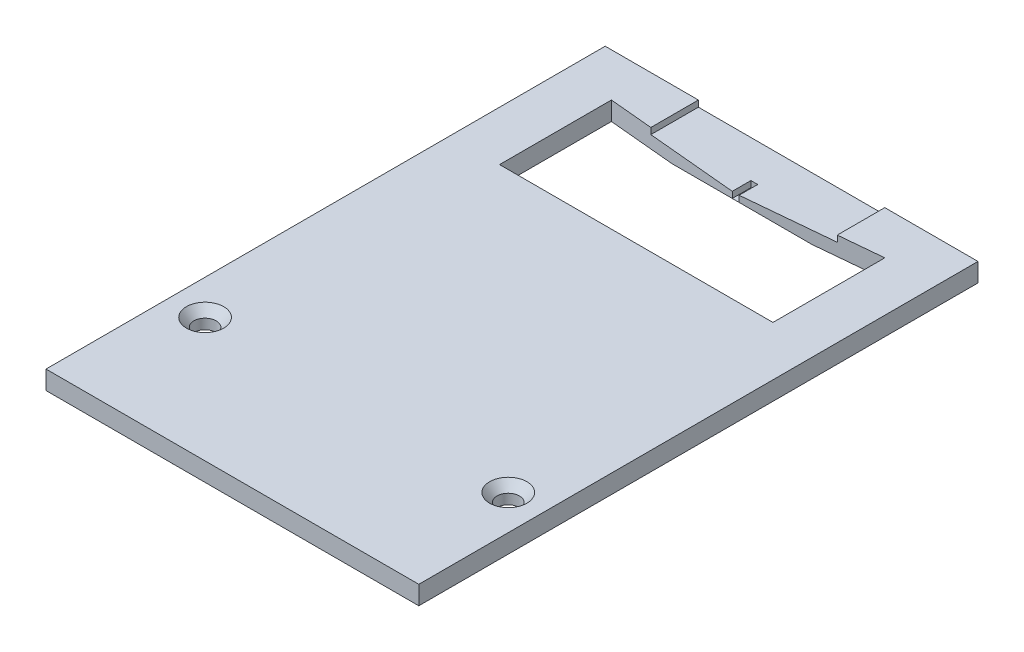
ISO-10303-21;
HEADER;
FILE_DESCRIPTION(('STEP AP214'),'2;1');
FILE_NAME('part.step','',(''),(''),'','','');
FILE_SCHEMA(('AUTOMOTIVE_DESIGN { 1 0 10303 214 1 1 1 1 }'));
ENDSEC;
DATA;
#1=APPLICATION_CONTEXT('core data for automotive mechanical design processes');
#2=APPLICATION_PROTOCOL_DEFINITION('international standard','automotive_design',2000,#1);
#3=PRODUCT_CONTEXT('',#1,'mechanical');
#4=PRODUCT('Part','Part','',(#3));
#5=PRODUCT_RELATED_PRODUCT_CATEGORY('part','',(#4));
#6=PRODUCT_DEFINITION_FORMATION('','',#4);
#7=PRODUCT_DEFINITION_CONTEXT('part definition',#1,'design');
#8=PRODUCT_DEFINITION('design','',#6,#7);
#9=PRODUCT_DEFINITION_SHAPE('','',#8);
#10=(LENGTH_UNIT() NAMED_UNIT(*) SI_UNIT(.MILLI.,.METRE.));
#11=(NAMED_UNIT(*) PLANE_ANGLE_UNIT() SI_UNIT($,.RADIAN.));
#12=(NAMED_UNIT(*) SI_UNIT($,.STERADIAN.) SOLID_ANGLE_UNIT());
#13=UNCERTAINTY_MEASURE_WITH_UNIT(LENGTH_MEASURE(1.E-05),#10,'distance_accuracy_value','');
#14=(GEOMETRIC_REPRESENTATION_CONTEXT(3) GLOBAL_UNCERTAINTY_ASSIGNED_CONTEXT((#13)) GLOBAL_UNIT_ASSIGNED_CONTEXT((#10,
#11,#12)) REPRESENTATION_CONTEXT('',''));
#15=CARTESIAN_POINT('',(0.,0.,0.));
#16=DIRECTION('',(0.,0.,1.));
#17=DIRECTION('',(1.,0.,0.));
#18=AXIS2_PLACEMENT_3D('',#15,#16,#17);
#19=CARTESIAN_POINT('',(0.,3.,0.));
#20=DIRECTION('',(0.,-1.,0.));
#21=DIRECTION('',(0.,0.,-1.));
#22=AXIS2_PLACEMENT_3D('',#19,#20,#21);
#23=PLANE('',#22);
#24=CARTESIAN_POINT('',(-24.4,3.,0.));
#25=DIRECTION('',(0.,1.,0.));
#26=DIRECTION('',(0.,0.,1.));
#27=AXIS2_PLACEMENT_3D('',#24,#25,#26);
#28=CIRCLE('',#27,3.);
#29=CARTESIAN_POINT('',(-24.4,3.,3.));
#30=VERTEX_POINT('',#29);
#31=EDGE_CURVE('E197',#30,#30,#28,.T.);
#32=ORIENTED_EDGE('',*,*,#31,.F.);
#33=EDGE_LOOP('',(#32));
#34=FACE_BOUND('',#33,.T.);
#35=CARTESIAN_POINT('',(24.4,3.,0.));
#36=DIRECTION('',(0.,1.,0.));
#37=DIRECTION('',(0.,0.,1.));
#38=AXIS2_PLACEMENT_3D('',#35,#36,#37);
#39=CIRCLE('',#38,3.);
#40=CARTESIAN_POINT('',(24.4,3.,3.));
#41=VERTEX_POINT('',#40);
#42=EDGE_CURVE('E200',#41,#41,#39,.T.);
#43=ORIENTED_EDGE('',*,*,#42,.F.);
#44=EDGE_LOOP('',(#43));
#45=FACE_BOUND('',#44,.T.);
#46=DIRECTION('',(-0.995681281474736,0.,0.09283741552212));
#47=VECTOR('',#46,1.);
#48=CARTESIAN_POINT('',(0.549999999999998,3.,-61.));
#49=LINE('',#48,#47);
#50=CARTESIAN_POINT('',(22.,3.,-63.));
#51=VERTEX_POINT('',#50);
#52=CARTESIAN_POINT('',(15.,3.,-62.3473193473193));
#53=VERTEX_POINT('',#52);
#54=EDGE_CURVE('E159',#51,#53,#49,.T.);
#55=ORIENTED_EDGE('',*,*,#54,.F.);
#56=DIRECTION('',(0.,0.,-1.));
#57=VECTOR('',#56,1.);
#58=CARTESIAN_POINT('',(22.,3.,-61.));
#59=LINE('',#58,#57);
#60=CARTESIAN_POINT('',(22.,3.,-45.));
#61=VERTEX_POINT('',#60);
#62=EDGE_CURVE('E254',#61,#51,#59,.T.);
#63=ORIENTED_EDGE('',*,*,#62,.F.);
#64=DIRECTION('',(1.,0.,0.));
#65=VECTOR('',#64,1.);
#66=CARTESIAN_POINT('',(-22.,3.,-45.));
#67=LINE('',#66,#65);
#68=CARTESIAN_POINT('',(-22.,3.,-45.));
#69=VERTEX_POINT('',#68);
#70=EDGE_CURVE('E251',#69,#61,#67,.T.);
#71=ORIENTED_EDGE('',*,*,#70,.F.);
#72=DIRECTION('',(0.,0.,1.));
#73=VECTOR('',#72,1.);
#74=CARTESIAN_POINT('',(-22.,3.,-61.));
#75=LINE('',#74,#73);
#76=CARTESIAN_POINT('',(-22.,3.,-63.));
#77=VERTEX_POINT('',#76);
#78=EDGE_CURVE('E249',#77,#69,#75,.T.);
#79=ORIENTED_EDGE('',*,*,#78,.F.);
#80=DIRECTION('',(-0.995681281474736,0.,-0.09283741552212));
#81=VECTOR('',#80,1.);
#82=CARTESIAN_POINT('',(-0.549999999999998,3.,-61.));
#83=LINE('',#82,#81);
#84=CARTESIAN_POINT('',(-15.,3.,-62.3473193473193));
#85=VERTEX_POINT('',#84);
#86=EDGE_CURVE('E175',#85,#77,#83,.T.);
#87=ORIENTED_EDGE('',*,*,#86,.F.);
#88=DIRECTION('',(0.,0.,1.));
#89=VECTOR('',#88,1.);
#90=CARTESIAN_POINT('',(-15.,3.,-61.));
#91=LINE('',#90,#89);
#92=CARTESIAN_POINT('',(-15.,3.,-70.));
#93=VERTEX_POINT('',#92);
#94=EDGE_CURVE('E225',#93,#85,#91,.T.);
#95=ORIENTED_EDGE('',*,*,#94,.F.);
#96=DIRECTION('',(-1.,0.,0.));
#97=VECTOR('',#96,1.);
#98=CARTESIAN_POINT('',(30.,3.,-70.));
#99=LINE('',#98,#97);
#100=CARTESIAN_POINT('',(-30.,3.,-70.));
#101=VERTEX_POINT('',#100);
#102=EDGE_CURVE('E274',#93,#101,#99,.T.);
#103=ORIENTED_EDGE('',*,*,#102,.T.);
#104=DIRECTION('',(0.,0.,1.));
#105=VECTOR('',#104,1.);
#106=CARTESIAN_POINT('',(-30.,3.,-20.));
#107=LINE('',#106,#105);
#108=CARTESIAN_POINT('',(-30.,3.,20.));
#109=VERTEX_POINT('',#108);
#110=EDGE_CURVE('E267',#101,#109,#107,.T.);
#111=ORIENTED_EDGE('',*,*,#110,.T.);
#112=DIRECTION('',(1.,0.,0.));
#113=VECTOR('',#112,1.);
#114=CARTESIAN_POINT('',(-30.,3.,20.));
#115=LINE('',#114,#113);
#116=CARTESIAN_POINT('',(30.,3.,20.));
#117=VERTEX_POINT('',#116);
#118=EDGE_CURVE('E269',#109,#117,#115,.T.);
#119=ORIENTED_EDGE('',*,*,#118,.T.);
#120=DIRECTION('',(0.,0.,-1.));
#121=VECTOR('',#120,1.);
#122=CARTESIAN_POINT('',(30.,3.,-20.));
#123=LINE('',#122,#121);
#124=CARTESIAN_POINT('',(30.,3.,-70.));
#125=VERTEX_POINT('',#124);
#126=EDGE_CURVE('E272',#117,#125,#123,.T.);
#127=ORIENTED_EDGE('',*,*,#126,.T.);
#128=CARTESIAN_POINT('',(15.,3.,-70.));
#129=VERTEX_POINT('',#128);
#130=EDGE_CURVE('E275',#125,#129,#99,.T.);
#131=ORIENTED_EDGE('',*,*,#130,.T.);
#132=DIRECTION('',(0.,0.,-1.));
#133=VECTOR('',#132,1.);
#134=CARTESIAN_POINT('',(15.,3.,-61.));
#135=LINE('',#134,#133);
#136=EDGE_CURVE('E235',#53,#129,#135,.T.);
#137=ORIENTED_EDGE('',*,*,#136,.F.);
#138=EDGE_LOOP('',(#55,#63,#71,#79,#87,#95,#103,#111,#119,#127,#131,#137));
#139=FACE_BOUND('',#138,.T.);
#140=ADVANCED_FACE('F35',(#34,#45,#139),#23,.F.);
#141=CARTESIAN_POINT('',(0.,0.,0.));
#142=DIRECTION('',(0.,-1.,0.));
#143=DIRECTION('',(0.,0.,-1.));
#144=AXIS2_PLACEMENT_3D('',#141,#142,#143);
#145=PLANE('',#144);
#146=DIRECTION('',(1.,0.,0.));
#147=VECTOR('',#146,1.);
#148=CARTESIAN_POINT('',(22.,0.,-62.));
#149=LINE('',#148,#147);
#150=CARTESIAN_POINT('',(-11.2749999999997,0.,-62.));
#151=VERTEX_POINT('',#150);
#152=CARTESIAN_POINT('',(11.2750000000001,0.,-62.));
#153=VERTEX_POINT('',#152);
#154=EDGE_CURVE('E50',#151,#153,#149,.T.);
#155=ORIENTED_EDGE('',*,*,#154,.F.);
#156=DIRECTION('',(-0.995681281474736,0.,-0.09283741552212));
#157=VECTOR('',#156,1.);
#158=CARTESIAN_POINT('',(-0.549999999999998,0.,-61.));
#159=LINE('',#158,#157);
#160=CARTESIAN_POINT('',(-22.,0.,-63.));
#161=VERTEX_POINT('',#160);
#162=EDGE_CURVE('E165',#151,#161,#159,.T.);
#163=ORIENTED_EDGE('',*,*,#162,.T.);
#164=DIRECTION('',(0.,0.,1.));
#165=VECTOR('',#164,1.);
#166=CARTESIAN_POINT('',(-22.,0.,-61.));
#167=LINE('',#166,#165);
#168=CARTESIAN_POINT('',(-22.,0.,-45.));
#169=VERTEX_POINT('',#168);
#170=EDGE_CURVE('E246',#161,#169,#167,.T.);
#171=ORIENTED_EDGE('',*,*,#170,.T.);
#172=DIRECTION('',(1.,0.,0.));
#173=VECTOR('',#172,1.);
#174=CARTESIAN_POINT('',(-22.,0.,-45.));
#175=LINE('',#174,#173);
#176=CARTESIAN_POINT('',(22.,0.,-45.));
#177=VERTEX_POINT('',#176);
#178=EDGE_CURVE('E258',#169,#177,#175,.T.);
#179=ORIENTED_EDGE('',*,*,#178,.T.);
#180=DIRECTION('',(0.,0.,-1.));
#181=VECTOR('',#180,1.);
#182=CARTESIAN_POINT('',(22.,0.,-61.));
#183=LINE('',#182,#181);
#184=CARTESIAN_POINT('',(22.,0.,-63.));
#185=VERTEX_POINT('',#184);
#186=EDGE_CURVE('E252',#177,#185,#183,.T.);
#187=ORIENTED_EDGE('',*,*,#186,.T.);
#188=DIRECTION('',(-0.995681281474736,0.,0.09283741552212));
#189=VECTOR('',#188,1.);
#190=CARTESIAN_POINT('',(0.549999999999998,0.,-61.));
#191=LINE('',#190,#189);
#192=EDGE_CURVE('E168',#185,#153,#191,.T.);
#193=ORIENTED_EDGE('',*,*,#192,.T.);
#194=EDGE_LOOP('',(#155,#163,#171,#179,#187,#193));
#195=FACE_BOUND('',#194,.T.);
#196=CARTESIAN_POINT('',(24.4,0.,0.));
#197=DIRECTION('',(0.,1.,0.));
#198=DIRECTION('',(0.,0.,1.));
#199=AXIS2_PLACEMENT_3D('',#196,#197,#198);
#200=CIRCLE('',#199,1.8);
#201=CARTESIAN_POINT('',(24.4,0.,1.8));
#202=VERTEX_POINT('',#201);
#203=EDGE_CURVE('E189',#202,#202,#200,.T.);
#204=ORIENTED_EDGE('',*,*,#203,.T.);
#205=EDGE_LOOP('',(#204));
#206=FACE_BOUND('',#205,.T.);
#207=CARTESIAN_POINT('',(-24.4,0.,0.));
#208=DIRECTION('',(0.,1.,0.));
#209=DIRECTION('',(0.,0.,1.));
#210=AXIS2_PLACEMENT_3D('',#207,#208,#209);
#211=CIRCLE('',#210,1.8);
#212=CARTESIAN_POINT('',(-24.4,0.,1.8));
#213=VERTEX_POINT('',#212);
#214=EDGE_CURVE('E193',#213,#213,#211,.T.);
#215=ORIENTED_EDGE('',*,*,#214,.T.);
#216=EDGE_LOOP('',(#215));
#217=FACE_BOUND('',#216,.T.);
#218=DIRECTION('',(0.,0.,1.));
#219=VECTOR('',#218,1.);
#220=CARTESIAN_POINT('',(-30.,0.,-20.));
#221=LINE('',#220,#219);
#222=CARTESIAN_POINT('',(-30.,0.,-70.));
#223=VERTEX_POINT('',#222);
#224=CARTESIAN_POINT('',(-30.,0.,20.));
#225=VERTEX_POINT('',#224);
#226=EDGE_CURVE('E266',#223,#225,#221,.T.);
#227=ORIENTED_EDGE('',*,*,#226,.F.);
#228=DIRECTION('',(-1.,0.,0.));
#229=VECTOR('',#228,1.);
#230=CARTESIAN_POINT('',(-30.,0.,-70.));
#231=LINE('',#230,#229);
#232=CARTESIAN_POINT('',(30.,0.,-70.));
#233=VERTEX_POINT('',#232);
#234=EDGE_CURVE('E270',#233,#223,#231,.T.);
#235=ORIENTED_EDGE('',*,*,#234,.F.);
#236=DIRECTION('',(0.,0.,-1.));
#237=VECTOR('',#236,1.);
#238=CARTESIAN_POINT('',(30.,0.,-20.));
#239=LINE('',#238,#237);
#240=CARTESIAN_POINT('',(30.,0.,20.));
#241=VERTEX_POINT('',#240);
#242=EDGE_CURVE('E283',#241,#233,#239,.T.);
#243=ORIENTED_EDGE('',*,*,#242,.F.);
#244=DIRECTION('',(1.,0.,0.));
#245=VECTOR('',#244,1.);
#246=CARTESIAN_POINT('',(-30.,0.,20.));
#247=LINE('',#246,#245);
#248=EDGE_CURVE('E280',#225,#241,#247,.T.);
#249=ORIENTED_EDGE('',*,*,#248,.F.);
#250=EDGE_LOOP('',(#227,#235,#243,#249));
#251=FACE_BOUND('',#250,.T.);
#252=ADVANCED_FACE('F163',(#195,#206,#217,#251),#145,.T.);
#253=CARTESIAN_POINT('',(-30.,3.,-20.));
#254=DIRECTION('',(1.,0.,0.));
#255=DIRECTION('',(0.,0.,-1.));
#256=AXIS2_PLACEMENT_3D('',#253,#254,#255);
#257=PLANE('',#256);
#258=ORIENTED_EDGE('',*,*,#226,.T.);
#259=DIRECTION('',(0.,-1.,0.));
#260=VECTOR('',#259,1.);
#261=CARTESIAN_POINT('',(-30.,3.,20.));
#262=LINE('',#261,#260);
#263=EDGE_CURVE('E43',#109,#225,#262,.T.);
#264=ORIENTED_EDGE('',*,*,#263,.F.);
#265=ORIENTED_EDGE('',*,*,#110,.F.);
#266=DIRECTION('',(0.,-1.,0.));
#267=VECTOR('',#266,1.);
#268=CARTESIAN_POINT('',(-30.,3.,-70.));
#269=LINE('',#268,#267);
#270=EDGE_CURVE('E278',#101,#223,#269,.T.);
#271=ORIENTED_EDGE('',*,*,#270,.T.);
#272=EDGE_LOOP('',(#258,#264,#265,#271));
#273=FACE_BOUND('',#272,.T.);
#274=ADVANCED_FACE('F37',(#273),#257,.F.);
#275=CARTESIAN_POINT('',(-30.,3.,20.));
#276=DIRECTION('',(0.,0.,-1.));
#277=DIRECTION('',(-1.,0.,0.));
#278=AXIS2_PLACEMENT_3D('',#275,#276,#277);
#279=PLANE('',#278);
#280=ORIENTED_EDGE('',*,*,#248,.T.);
#281=DIRECTION('',(0.,-1.,0.));
#282=VECTOR('',#281,1.);
#283=CARTESIAN_POINT('',(30.,3.,20.));
#284=LINE('',#283,#282);
#285=EDGE_CURVE('E293',#117,#241,#284,.T.);
#286=ORIENTED_EDGE('',*,*,#285,.F.);
#287=ORIENTED_EDGE('',*,*,#118,.F.);
#288=ORIENTED_EDGE('',*,*,#263,.T.);
#289=EDGE_LOOP('',(#280,#286,#287,#288));
#290=FACE_BOUND('',#289,.T.);
#291=ADVANCED_FACE('F339',(#290),#279,.F.);
#292=CARTESIAN_POINT('',(30.,3.,-20.));
#293=DIRECTION('',(-1.,0.,0.));
#294=DIRECTION('',(0.,0.,1.));
#295=AXIS2_PLACEMENT_3D('',#292,#293,#294);
#296=PLANE('',#295);
#297=ORIENTED_EDGE('',*,*,#242,.T.);
#298=DIRECTION('',(0.,-1.,0.));
#299=VECTOR('',#298,1.);
#300=CARTESIAN_POINT('',(30.,3.,-70.));
#301=LINE('',#300,#299);
#302=EDGE_CURVE('E290',#125,#233,#301,.T.);
#303=ORIENTED_EDGE('',*,*,#302,.F.);
#304=ORIENTED_EDGE('',*,*,#126,.F.);
#305=ORIENTED_EDGE('',*,*,#285,.T.);
#306=EDGE_LOOP('',(#297,#303,#304,#305));
#307=FACE_BOUND('',#306,.T.);
#308=ADVANCED_FACE('F336',(#307),#296,.F.);
#309=CARTESIAN_POINT('',(-30.,3.,-70.));
#310=DIRECTION('',(0.,0.,1.));
#311=DIRECTION('',(1.,0.,0.));
#312=AXIS2_PLACEMENT_3D('',#309,#310,#311);
#313=PLANE('',#312);
#314=ORIENTED_EDGE('',*,*,#102,.F.);
#315=DIRECTION('',(0.,1.,0.));
#316=VECTOR('',#315,1.);
#317=CARTESIAN_POINT('',(-15.,2.,-70.));
#318=LINE('',#317,#316);
#319=CARTESIAN_POINT('',(-15.,2.,-70.));
#320=VERTEX_POINT('',#319);
#321=EDGE_CURVE('E244',#320,#93,#318,.T.);
#322=ORIENTED_EDGE('',*,*,#321,.F.);
#323=DIRECTION('',(-1.,0.,0.));
#324=VECTOR('',#323,1.);
#325=CARTESIAN_POINT('',(-15.,2.,-70.));
#326=LINE('',#325,#324);
#327=CARTESIAN_POINT('',(15.,2.,-70.));
#328=VERTEX_POINT('',#327);
#329=EDGE_CURVE('E237',#328,#320,#326,.T.);
#330=ORIENTED_EDGE('',*,*,#329,.F.);
#331=DIRECTION('',(0.,1.,0.));
#332=VECTOR('',#331,1.);
#333=CARTESIAN_POINT('',(15.,2.,-70.));
#334=LINE('',#333,#332);
#335=EDGE_CURVE('E240',#328,#129,#334,.T.);
#336=ORIENTED_EDGE('',*,*,#335,.T.);
#337=ORIENTED_EDGE('',*,*,#130,.F.);
#338=ORIENTED_EDGE('',*,*,#302,.T.);
#339=ORIENTED_EDGE('',*,*,#234,.T.);
#340=ORIENTED_EDGE('',*,*,#270,.F.);
#341=EDGE_LOOP('',(#314,#322,#330,#336,#337,#338,#339,#340));
#342=FACE_BOUND('',#341,.T.);
#343=ADVANCED_FACE('F333',(#342),#313,.F.);
#344=CARTESIAN_POINT('',(-22.,3.,-61.));
#345=DIRECTION('',(1.,0.,0.));
#346=DIRECTION('',(0.,0.,-1.));
#347=AXIS2_PLACEMENT_3D('',#344,#345,#346);
#348=PLANE('',#347);
#349=ORIENTED_EDGE('',*,*,#170,.F.);
#350=DIRECTION('',(0.,1.,0.));
#351=VECTOR('',#350,1.);
#352=CARTESIAN_POINT('',(-22.,0.,-63.));
#353=LINE('',#352,#351);
#354=EDGE_CURVE('E174',#161,#77,#353,.T.);
#355=ORIENTED_EDGE('',*,*,#354,.T.);
#356=ORIENTED_EDGE('',*,*,#78,.T.);
#357=DIRECTION('',(0.,-1.,0.));
#358=VECTOR('',#357,1.);
#359=CARTESIAN_POINT('',(-22.,3.,-45.));
#360=LINE('',#359,#358);
#361=EDGE_CURVE('E263',#69,#169,#360,.T.);
#362=ORIENTED_EDGE('',*,*,#361,.T.);
#363=EDGE_LOOP('',(#349,#355,#356,#362));
#364=FACE_BOUND('',#363,.T.);
#365=ADVANCED_FACE('F330',(#364),#348,.T.);
#366=CARTESIAN_POINT('',(-22.,3.,-45.));
#367=DIRECTION('',(0.,0.,-1.));
#368=DIRECTION('',(-1.,0.,0.));
#369=AXIS2_PLACEMENT_3D('',#366,#367,#368);
#370=PLANE('',#369);
#371=ORIENTED_EDGE('',*,*,#178,.F.);
#372=ORIENTED_EDGE('',*,*,#361,.F.);
#373=ORIENTED_EDGE('',*,*,#70,.T.);
#374=DIRECTION('',(0.,-1.,0.));
#375=VECTOR('',#374,1.);
#376=CARTESIAN_POINT('',(22.,3.,-45.));
#377=LINE('',#376,#375);
#378=EDGE_CURVE('E256',#61,#177,#377,.T.);
#379=ORIENTED_EDGE('',*,*,#378,.T.);
#380=EDGE_LOOP('',(#371,#372,#373,#379));
#381=FACE_BOUND('',#380,.T.);
#382=ADVANCED_FACE('F391',(#381),#370,.T.);
#383=CARTESIAN_POINT('',(22.,3.,-61.));
#384=DIRECTION('',(-1.,0.,0.));
#385=DIRECTION('',(0.,0.,1.));
#386=AXIS2_PLACEMENT_3D('',#383,#384,#385);
#387=PLANE('',#386);
#388=ORIENTED_EDGE('',*,*,#186,.F.);
#389=ORIENTED_EDGE('',*,*,#378,.F.);
#390=ORIENTED_EDGE('',*,*,#62,.T.);
#391=DIRECTION('',(0.,1.,0.));
#392=VECTOR('',#391,1.);
#393=CARTESIAN_POINT('',(22.,0.,-63.));
#394=LINE('',#393,#392);
#395=EDGE_CURVE('E373',#185,#51,#394,.T.);
#396=ORIENTED_EDGE('',*,*,#395,.F.);
#397=EDGE_LOOP('',(#388,#389,#390,#396));
#398=FACE_BOUND('',#397,.T.);
#399=ADVANCED_FACE('F387',(#398),#387,.T.);
#400=CARTESIAN_POINT('',(-15.,2.,-61.));
#401=DIRECTION('',(-1.,0.,0.));
#402=DIRECTION('',(0.,0.,1.));
#403=AXIS2_PLACEMENT_3D('',#400,#401,#402);
#404=PLANE('',#403);
#405=ORIENTED_EDGE('',*,*,#94,.T.);
#406=DIRECTION('',(0.,-1.,0.));
#407=VECTOR('',#406,1.);
#408=CARTESIAN_POINT('',(-15.,2.,-62.3473193473193));
#409=LINE('',#408,#407);
#410=CARTESIAN_POINT('',(-15.,2.,-62.3473193473193));
#411=VERTEX_POINT('',#410);
#412=EDGE_CURVE('E186',#85,#411,#409,.T.);
#413=ORIENTED_EDGE('',*,*,#412,.T.);
#414=DIRECTION('',(0.,0.,1.));
#415=VECTOR('',#414,1.);
#416=CARTESIAN_POINT('',(-15.,2.,-61.));
#417=LINE('',#416,#415);
#418=EDGE_CURVE('E231',#320,#411,#417,.T.);
#419=ORIENTED_EDGE('',*,*,#418,.F.);
#420=ORIENTED_EDGE('',*,*,#321,.T.);
#421=EDGE_LOOP('',(#405,#413,#419,#420));
#422=FACE_BOUND('',#421,.T.);
#423=ADVANCED_FACE('F402',(#422),#404,.F.);
#424=CARTESIAN_POINT('',(15.,2.,-61.));
#425=DIRECTION('',(1.,0.,0.));
#426=DIRECTION('',(0.,0.,-1.));
#427=AXIS2_PLACEMENT_3D('',#424,#425,#426);
#428=PLANE('',#427);
#429=DIRECTION('',(0.,0.,-1.));
#430=VECTOR('',#429,1.);
#431=CARTESIAN_POINT('',(15.,2.,-61.));
#432=LINE('',#431,#430);
#433=CARTESIAN_POINT('',(15.,2.,-62.3473193473193));
#434=VERTEX_POINT('',#433);
#435=EDGE_CURVE('E234',#434,#328,#432,.T.);
#436=ORIENTED_EDGE('',*,*,#435,.F.);
#437=DIRECTION('',(0.,1.,0.));
#438=VECTOR('',#437,1.);
#439=CARTESIAN_POINT('',(15.,2.,-62.3473193473193));
#440=LINE('',#439,#438);
#441=EDGE_CURVE('E179',#434,#53,#440,.T.);
#442=ORIENTED_EDGE('',*,*,#441,.T.);
#443=ORIENTED_EDGE('',*,*,#136,.T.);
#444=ORIENTED_EDGE('',*,*,#335,.F.);
#445=EDGE_LOOP('',(#436,#442,#443,#444));
#446=FACE_BOUND('',#445,.T.);
#447=ADVANCED_FACE('F367',(#446),#428,.F.);
#448=CARTESIAN_POINT('',(0.,2.,0.));
#449=DIRECTION('',(0.,-1.,0.));
#450=DIRECTION('',(0.,0.,-1.));
#451=AXIS2_PLACEMENT_3D('',#448,#449,#450);
#452=PLANE('',#451);
#453=DIRECTION('',(0.,0.,-1.));
#454=VECTOR('',#453,1.);
#455=CARTESIAN_POINT('',(0.55,2.,-64.));
#456=LINE('',#455,#454);
#457=CARTESIAN_POINT('',(0.549999999999997,2.,-61.));
#458=VERTEX_POINT('',#457);
#459=CARTESIAN_POINT('',(0.55,2.,-64.));
#460=VERTEX_POINT('',#459);
#461=EDGE_CURVE('E218',#458,#460,#456,.T.);
#462=ORIENTED_EDGE('',*,*,#461,.F.);
#463=DIRECTION('',(0.995681281474736,0.,-0.09283741552212));
#464=VECTOR('',#463,1.);
#465=CARTESIAN_POINT('',(-5.63388475606143,2.,-60.4234140087588));
#466=LINE('',#465,#464);
#467=EDGE_CURVE('E57',#458,#434,#466,.T.);
#468=ORIENTED_EDGE('',*,*,#467,.T.);
#469=ORIENTED_EDGE('',*,*,#435,.T.);
#470=ORIENTED_EDGE('',*,*,#329,.T.);
#471=ORIENTED_EDGE('',*,*,#418,.T.);
#472=DIRECTION('',(0.995681281474736,0.,0.09283741552212));
#473=VECTOR('',#472,1.);
#474=CARTESIAN_POINT('',(5.63388475606143,2.,-60.4234140087588));
#475=LINE('',#474,#473);
#476=CARTESIAN_POINT('',(-0.549999999999998,2.,-61.));
#477=VERTEX_POINT('',#476);
#478=EDGE_CURVE('E177',#411,#477,#475,.T.);
#479=ORIENTED_EDGE('',*,*,#478,.T.);
#480=DIRECTION('',(0.,0.,1.));
#481=VECTOR('',#480,1.);
#482=CARTESIAN_POINT('',(-0.550000000000001,2.,-64.));
#483=LINE('',#482,#481);
#484=CARTESIAN_POINT('',(-0.550000000000001,2.,-64.));
#485=VERTEX_POINT('',#484);
#486=EDGE_CURVE('E203',#485,#477,#483,.T.);
#487=ORIENTED_EDGE('',*,*,#486,.F.);
#488=DIRECTION('',(-1.,0.,0.));
#489=VECTOR('',#488,1.);
#490=CARTESIAN_POINT('',(-0.550000000000001,2.,-64.));
#491=LINE('',#490,#489);
#492=EDGE_CURVE('E207',#460,#485,#491,.T.);
#493=ORIENTED_EDGE('',*,*,#492,.F.);
#494=EDGE_LOOP('',(#462,#468,#469,#470,#471,#479,#487,#493));
#495=FACE_BOUND('',#494,.T.);
#496=ADVANCED_FACE('F378',(#495),#452,.F.);
#497=CARTESIAN_POINT('',(-0.550000000000001,1.,-64.));
#498=DIRECTION('',(-1.,0.,0.));
#499=DIRECTION('',(0.,0.,1.));
#500=AXIS2_PLACEMENT_3D('',#497,#498,#499);
#501=PLANE('',#500);
#502=ORIENTED_EDGE('',*,*,#486,.T.);
#503=DIRECTION('',(0.,1.,0.));
#504=VECTOR('',#503,1.);
#505=CARTESIAN_POINT('',(-0.55,1.,-61.));
#506=LINE('',#505,#504);
#507=CARTESIAN_POINT('',(-0.550000000000049,0.999999999999998,-61.));
#508=VERTEX_POINT('',#507);
#509=EDGE_CURVE('E215',#508,#477,#506,.T.);
#510=ORIENTED_EDGE('',*,*,#509,.F.);
#511=DIRECTION('',(0.,0.,1.));
#512=VECTOR('',#511,1.);
#513=CARTESIAN_POINT('',(-0.550000000000001,1.,-64.));
#514=LINE('',#513,#512);
#515=CARTESIAN_POINT('',(-0.550000000000001,1.,-64.));
#516=VERTEX_POINT('',#515);
#517=EDGE_CURVE('E204',#516,#508,#514,.T.);
#518=ORIENTED_EDGE('',*,*,#517,.F.);
#519=DIRECTION('',(0.,1.,0.));
#520=VECTOR('',#519,1.);
#521=CARTESIAN_POINT('',(-0.550000000000001,1.,-64.));
#522=LINE('',#521,#520);
#523=EDGE_CURVE('E223',#516,#485,#522,.T.);
#524=ORIENTED_EDGE('',*,*,#523,.T.);
#525=EDGE_LOOP('',(#502,#510,#518,#524));
#526=FACE_BOUND('',#525,.T.);
#527=ADVANCED_FACE('F412',(#526),#501,.F.);
#528=CARTESIAN_POINT('',(-0.550000000000001,1.,-64.));
#529=DIRECTION('',(0.,0.,-1.));
#530=DIRECTION('',(-1.,0.,0.));
#531=AXIS2_PLACEMENT_3D('',#528,#529,#530);
#532=PLANE('',#531);
#533=ORIENTED_EDGE('',*,*,#492,.T.);
#534=ORIENTED_EDGE('',*,*,#523,.F.);
#535=DIRECTION('',(-1.,0.,0.));
#536=VECTOR('',#535,1.);
#537=CARTESIAN_POINT('',(-0.550000000000001,1.,-64.));
#538=LINE('',#537,#536);
#539=CARTESIAN_POINT('',(0.55,1.,-64.));
#540=VERTEX_POINT('',#539);
#541=EDGE_CURVE('E212',#540,#516,#538,.T.);
#542=ORIENTED_EDGE('',*,*,#541,.F.);
#543=DIRECTION('',(0.,1.,0.));
#544=VECTOR('',#543,1.);
#545=CARTESIAN_POINT('',(0.55,1.,-64.));
#546=LINE('',#545,#544);
#547=EDGE_CURVE('E226',#540,#460,#546,.T.);
#548=ORIENTED_EDGE('',*,*,#547,.T.);
#549=EDGE_LOOP('',(#533,#534,#542,#548));
#550=FACE_BOUND('',#549,.T.);
#551=ADVANCED_FACE('F415',(#550),#532,.F.);
#552=CARTESIAN_POINT('',(0.55,1.,-64.));
#553=DIRECTION('',(1.,0.,0.));
#554=DIRECTION('',(0.,0.,-1.));
#555=AXIS2_PLACEMENT_3D('',#552,#553,#554);
#556=PLANE('',#555);
#557=ORIENTED_EDGE('',*,*,#461,.T.);
#558=ORIENTED_EDGE('',*,*,#547,.F.);
#559=DIRECTION('',(0.,0.,-1.));
#560=VECTOR('',#559,1.);
#561=CARTESIAN_POINT('',(0.55,1.,-64.));
#562=LINE('',#561,#560);
#563=CARTESIAN_POINT('',(0.550000000000046,0.999999999999998,-61.));
#564=VERTEX_POINT('',#563);
#565=EDGE_CURVE('E209',#564,#540,#562,.T.);
#566=ORIENTED_EDGE('',*,*,#565,.F.);
#567=DIRECTION('',(0.,1.,0.));
#568=VECTOR('',#567,1.);
#569=CARTESIAN_POINT('',(0.55,1.,-61.));
#570=LINE('',#569,#568);
#571=EDGE_CURVE('E228',#564,#458,#570,.T.);
#572=ORIENTED_EDGE('',*,*,#571,.T.);
#573=EDGE_LOOP('',(#557,#558,#566,#572));
#574=FACE_BOUND('',#573,.T.);
#575=ADVANCED_FACE('F382',(#574),#556,.F.);
#576=CARTESIAN_POINT('',(0.,1.,0.));
#577=DIRECTION('',(0.,1.,0.));
#578=DIRECTION('',(0.,0.,1.));
#579=AXIS2_PLACEMENT_3D('',#576,#577,#578);
#580=PLANE('',#579);
#581=ORIENTED_EDGE('',*,*,#517,.T.);
#582=DIRECTION('',(1.,0.,0.));
#583=VECTOR('',#582,1.);
#584=CARTESIAN_POINT('',(-0.55,1.,-61.));
#585=LINE('',#584,#583);
#586=EDGE_CURVE('E155',#508,#564,#585,.T.);
#587=ORIENTED_EDGE('',*,*,#586,.T.);
#588=ORIENTED_EDGE('',*,*,#565,.T.);
#589=ORIENTED_EDGE('',*,*,#541,.T.);
#590=EDGE_LOOP('',(#581,#587,#588,#589));
#591=FACE_BOUND('',#590,.T.);
#592=ADVANCED_FACE('F419',(#591),#580,.T.);
#593=CARTESIAN_POINT('',(24.4,3.,0.));
#594=DIRECTION('',(0.,1.,0.));
#595=DIRECTION('',(0.,0.,1.));
#596=AXIS2_PLACEMENT_3D('',#593,#594,#595);
#597=CONICAL_SURFACE('',#596,3.,0.715584993317677);
#598=CARTESIAN_POINT('',(24.4,1.61955791133479,0.));
#599=DIRECTION('',(0.,1.,0.));
#600=DIRECTION('',(0.,0.,1.));
#601=AXIS2_PLACEMENT_3D('',#598,#599,#600);
#602=CIRCLE('',#601,1.8);
#603=CARTESIAN_POINT('',(24.4,1.61955791133479,1.8));
#604=VERTEX_POINT('',#603);
#605=EDGE_CURVE('E192',#604,#604,#602,.F.);
#606=ORIENTED_EDGE('',*,*,#605,.T.);
#607=EDGE_LOOP('',(#606));
#608=FACE_BOUND('',#607,.T.);
#609=ORIENTED_EDGE('',*,*,#42,.T.);
#610=EDGE_LOOP('',(#609));
#611=FACE_BOUND('',#610,.T.);
#612=ADVANCED_FACE('F302',(#608,#611),#597,.F.);
#613=CARTESIAN_POINT('',(-24.4,3.,0.));
#614=DIRECTION('',(0.,1.,0.));
#615=DIRECTION('',(0.,0.,1.));
#616=AXIS2_PLACEMENT_3D('',#613,#614,#615);
#617=CONICAL_SURFACE('',#616,3.,0.715584993317677);
#618=CARTESIAN_POINT('',(-24.4,1.61955791133479,0.));
#619=DIRECTION('',(0.,1.,0.));
#620=DIRECTION('',(0.,0.,1.));
#621=AXIS2_PLACEMENT_3D('',#618,#619,#620);
#622=CIRCLE('',#621,1.8);
#623=CARTESIAN_POINT('',(-24.4,1.61955791133479,1.8));
#624=VERTEX_POINT('',#623);
#625=EDGE_CURVE('E196',#624,#624,#622,.F.);
#626=ORIENTED_EDGE('',*,*,#625,.T.);
#627=EDGE_LOOP('',(#626));
#628=FACE_BOUND('',#627,.T.);
#629=ORIENTED_EDGE('',*,*,#31,.T.);
#630=EDGE_LOOP('',(#629));
#631=FACE_BOUND('',#630,.T.);
#632=ADVANCED_FACE('F316',(#628,#631),#617,.F.);
#633=CARTESIAN_POINT('',(-24.4,0.,0.));
#634=DIRECTION('',(0.,1.,0.));
#635=DIRECTION('',(0.,0.,1.));
#636=AXIS2_PLACEMENT_3D('',#633,#634,#635);
#637=CYLINDRICAL_SURFACE('',#636,1.8);
#638=ORIENTED_EDGE('',*,*,#214,.F.);
#639=EDGE_LOOP('',(#638));
#640=FACE_BOUND('',#639,.T.);
#641=ORIENTED_EDGE('',*,*,#625,.F.);
#642=EDGE_LOOP('',(#641));
#643=FACE_BOUND('',#642,.T.);
#644=ADVANCED_FACE('F307',(#640,#643),#637,.F.);
#645=CARTESIAN_POINT('',(24.4,0.,0.));
#646=DIRECTION('',(0.,1.,0.));
#647=DIRECTION('',(0.,0.,1.));
#648=AXIS2_PLACEMENT_3D('',#645,#646,#647);
#649=CYLINDRICAL_SURFACE('',#648,1.8);
#650=ORIENTED_EDGE('',*,*,#203,.F.);
#651=EDGE_LOOP('',(#650));
#652=FACE_BOUND('',#651,.T.);
#653=ORIENTED_EDGE('',*,*,#605,.F.);
#654=EDGE_LOOP('',(#653));
#655=FACE_BOUND('',#654,.T.);
#656=ADVANCED_FACE('F305',(#652,#655),#649,.F.);
#657=CARTESIAN_POINT('',(-0.549999999999998,0.,-61.));
#658=DIRECTION('',(0.09283741552212,0.,-0.995681281474736));
#659=DIRECTION('',(-0.995681281474736,0.,-0.09283741552212));
#660=AXIS2_PLACEMENT_3D('',#657,#658,#659);
#661=PLANE('',#660);
#662=ORIENTED_EDGE('',*,*,#162,.F.);
#663=DIRECTION('',(0.991418037947735,0.0924399102981567,0.0924399102981572));
#664=VECTOR('',#663,1.);
#665=CARTESIAN_POINT('',(-0.641646594495862,0.991454862984069,-61.0085451370159));
#666=LINE('',#665,#664);
#667=EDGE_CURVE('E152',#151,#508,#666,.T.);
#668=ORIENTED_EDGE('',*,*,#667,.T.);
#669=ORIENTED_EDGE('',*,*,#509,.T.);
#670=ORIENTED_EDGE('',*,*,#478,.F.);
#671=ORIENTED_EDGE('',*,*,#412,.F.);
#672=ORIENTED_EDGE('',*,*,#86,.T.);
#673=ORIENTED_EDGE('',*,*,#354,.F.);
#674=EDGE_LOOP('',(#662,#668,#669,#670,#671,#672,#673));
#675=FACE_BOUND('',#674,.T.);
#676=ADVANCED_FACE('F171',(#675),#661,.F.);
#677=CARTESIAN_POINT('',(0.549999999999998,0.,-61.));
#678=DIRECTION('',(-0.09283741552212,0.,-0.995681281474736));
#679=DIRECTION('',(-0.995681281474736,0.,0.09283741552212));
#680=AXIS2_PLACEMENT_3D('',#677,#678,#679);
#681=PLANE('',#680);
#682=ORIENTED_EDGE('',*,*,#571,.F.);
#683=DIRECTION('',(0.991418037947735,-0.092439910298157,-0.0924399102981572));
#684=VECTOR('',#683,1.);
#685=CARTESIAN_POINT('',(0.641646594495862,0.991454862984069,-61.0085451370159));
#686=LINE('',#685,#684);
#687=EDGE_CURVE('E11',#564,#153,#686,.T.);
#688=ORIENTED_EDGE('',*,*,#687,.T.);
#689=ORIENTED_EDGE('',*,*,#192,.F.);
#690=ORIENTED_EDGE('',*,*,#395,.T.);
#691=ORIENTED_EDGE('',*,*,#54,.T.);
#692=ORIENTED_EDGE('',*,*,#441,.F.);
#693=ORIENTED_EDGE('',*,*,#467,.F.);
#694=EDGE_LOOP('',(#682,#688,#689,#690,#691,#692,#693));
#695=FACE_BOUND('',#694,.T.);
#696=ADVANCED_FACE('F314',(#695),#681,.F.);
#697=CARTESIAN_POINT('',(22.,0.,-62.));
#698=DIRECTION('',(0.,0.707106781186549,-0.707106781186546));
#699=DIRECTION('',(0.,0.707106781186546,0.707106781186549));
#700=AXIS2_PLACEMENT_3D('',#697,#698,#699);
#701=PLANE('',#700);
#702=ORIENTED_EDGE('',*,*,#154,.T.);
#703=ORIENTED_EDGE('',*,*,#687,.F.);
#704=ORIENTED_EDGE('',*,*,#586,.F.);
#705=ORIENTED_EDGE('',*,*,#667,.F.);
#706=EDGE_LOOP('',(#702,#703,#704,#705));
#707=FACE_BOUND('',#706,.T.);
#708=ADVANCED_FACE('F153',(#707),#701,.F.);
#709=CLOSED_SHELL('',(#140,#252,#274,#291,#308,#343,#365,#382,#399,#423,#447,#496,#527,#551,
#575,#592,#612,#632,#644,#656,#676,#696,#708));
#710=MANIFOLD_SOLID_BREP('B2',#709);
#711=ADVANCED_BREP_SHAPE_REPRESENTATION('',(#18,#710),#14);
#712=SHAPE_DEFINITION_REPRESENTATION(#9,#711);
ENDSEC;
END-ISO-10303-21;
